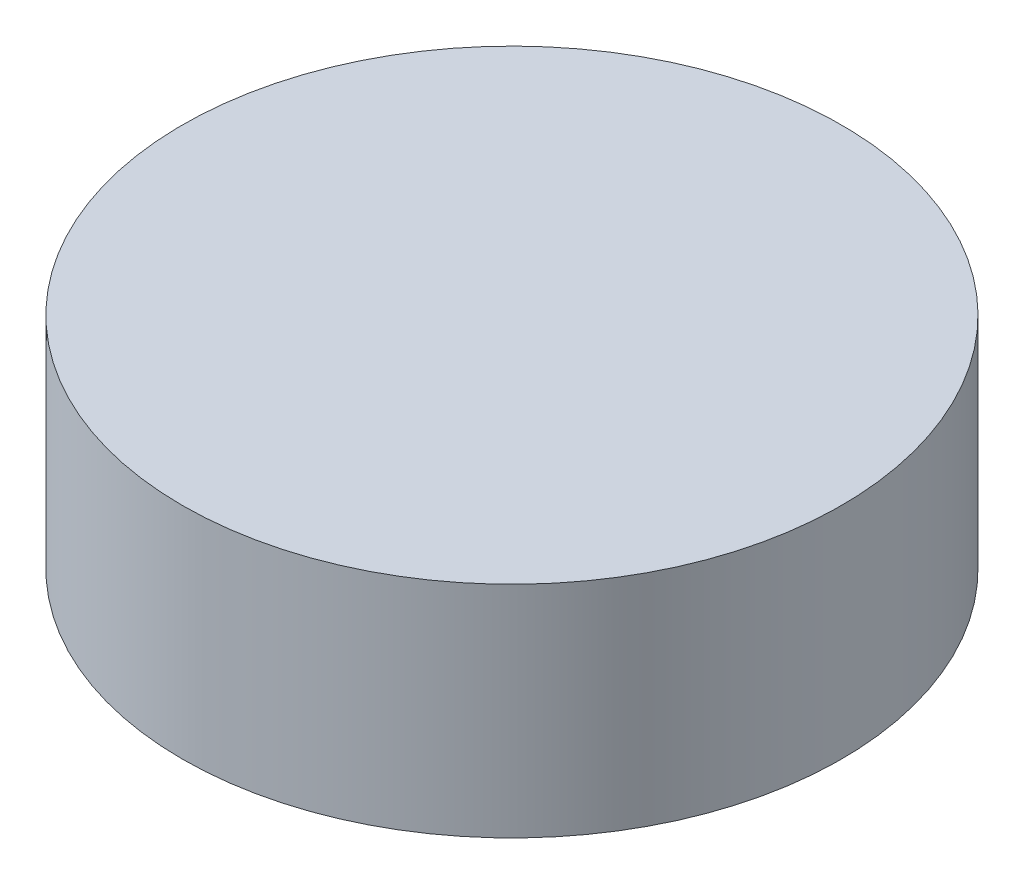
ISO-10303-21;
HEADER;
FILE_DESCRIPTION(('STEP AP214'),'2;1');
FILE_NAME('part.step','',(''),(''),'','','');
FILE_SCHEMA(('AUTOMOTIVE_DESIGN { 1 0 10303 214 1 1 1 1 }'));
ENDSEC;
DATA;
#1=APPLICATION_CONTEXT('core data for automotive mechanical design processes');
#2=APPLICATION_PROTOCOL_DEFINITION('international standard','automotive_design',2000,#1);
#3=PRODUCT_CONTEXT('',#1,'mechanical');
#4=PRODUCT('Part','Part','',(#3));
#5=PRODUCT_RELATED_PRODUCT_CATEGORY('part','',(#4));
#6=PRODUCT_DEFINITION_FORMATION('','',#4);
#7=PRODUCT_DEFINITION_CONTEXT('part definition',#1,'design');
#8=PRODUCT_DEFINITION('design','',#6,#7);
#9=PRODUCT_DEFINITION_SHAPE('','',#8);
#10=(LENGTH_UNIT() NAMED_UNIT(*) SI_UNIT(.MILLI.,.METRE.));
#11=(NAMED_UNIT(*) PLANE_ANGLE_UNIT() SI_UNIT($,.RADIAN.));
#12=(NAMED_UNIT(*) SI_UNIT($,.STERADIAN.) SOLID_ANGLE_UNIT());
#13=UNCERTAINTY_MEASURE_WITH_UNIT(LENGTH_MEASURE(1.E-05),#10,'distance_accuracy_value','');
#14=(GEOMETRIC_REPRESENTATION_CONTEXT(3) GLOBAL_UNCERTAINTY_ASSIGNED_CONTEXT((#13)) GLOBAL_UNIT_ASSIGNED_CONTEXT((#10,
#11,#12)) REPRESENTATION_CONTEXT('',''));
#15=CARTESIAN_POINT('',(0.,0.,0.));
#16=DIRECTION('',(0.,0.,1.));
#17=DIRECTION('',(1.,0.,0.));
#18=AXIS2_PLACEMENT_3D('',#15,#16,#17);
#19=CARTESIAN_POINT('',(0.,10.,0.));
#20=DIRECTION('',(0.,-1.,0.));
#21=DIRECTION('',(0.,0.,-1.));
#22=AXIS2_PLACEMENT_3D('',#19,#20,#21);
#23=CYLINDRICAL_SURFACE('',#22,30.);
#24=CARTESIAN_POINT('',(0.,10.,0.));
#25=DIRECTION('',(0.,1.,0.));
#26=DIRECTION('',(0.,0.,1.));
#27=AXIS2_PLACEMENT_3D('',#24,#25,#26);
#28=CIRCLE('',#27,30.);
#29=CARTESIAN_POINT('',(0.,10.,30.));
#30=VERTEX_POINT('',#29);
#31=EDGE_CURVE('E10',#30,#30,#28,.T.);
#32=ORIENTED_EDGE('',*,*,#31,.F.);
#33=EDGE_LOOP('',(#32));
#34=FACE_BOUND('',#33,.T.);
#35=CARTESIAN_POINT('',(0.,-10.,0.));
#36=DIRECTION('',(0.,1.,0.));
#37=DIRECTION('',(0.,0.,1.));
#38=AXIS2_PLACEMENT_3D('',#35,#36,#37);
#39=CIRCLE('',#38,30.);
#40=CARTESIAN_POINT('',(0.,-10.,30.));
#41=VERTEX_POINT('',#40);
#42=EDGE_CURVE('E34',#41,#41,#39,.T.);
#43=ORIENTED_EDGE('',*,*,#42,.T.);
#44=EDGE_LOOP('',(#43));
#45=FACE_BOUND('',#44,.T.);
#46=ADVANCED_FACE('F31',(#34,#45),#23,.T.);
#47=CARTESIAN_POINT('',(0.,10.,0.));
#48=DIRECTION('',(0.,1.,0.));
#49=DIRECTION('',(0.,0.,1.));
#50=AXIS2_PLACEMENT_3D('',#47,#48,#49);
#51=PLANE('',#50);
#52=ORIENTED_EDGE('',*,*,#31,.T.);
#53=EDGE_LOOP('',(#52));
#54=FACE_BOUND('',#53,.T.);
#55=ADVANCED_FACE('F60',(#54),#51,.T.);
#56=CARTESIAN_POINT('',(0.,-10.,0.));
#57=DIRECTION('',(0.,1.,0.));
#58=DIRECTION('',(0.,0.,1.));
#59=AXIS2_PLACEMENT_3D('',#56,#57,#58);
#60=PLANE('',#59);
#61=CARTESIAN_POINT('',(0.,-10.,0.));
#62=DIRECTION('',(0.,-1.,0.));
#63=DIRECTION('',(0.,0.,-1.));
#64=AXIS2_PLACEMENT_3D('',#61,#62,#63);
#65=CIRCLE('',#64,23.);
#66=CARTESIAN_POINT('',(0.,-10.,-23.));
#67=VERTEX_POINT('',#66);
#68=EDGE_CURVE('E43',#67,#67,#65,.T.);
#69=ORIENTED_EDGE('',*,*,#68,.F.);
#70=EDGE_LOOP('',(#69));
#71=FACE_BOUND('',#70,.T.);
#72=ORIENTED_EDGE('',*,*,#42,.F.);
#73=EDGE_LOOP('',(#72));
#74=FACE_BOUND('',#73,.T.);
#75=ADVANCED_FACE('F54',(#71,#74),#60,.F.);
#76=CARTESIAN_POINT('',(0.,5.,0.));
#77=DIRECTION('',(0.,-1.,0.));
#78=DIRECTION('',(0.,0.,-1.));
#79=AXIS2_PLACEMENT_3D('',#76,#77,#78);
#80=CYLINDRICAL_SURFACE('',#79,23.);
#81=CARTESIAN_POINT('',(0.,5.,0.));
#82=DIRECTION('',(0.,-1.,0.));
#83=DIRECTION('',(0.,0.,-1.));
#84=AXIS2_PLACEMENT_3D('',#81,#82,#83);
#85=CIRCLE('',#84,23.);
#86=CARTESIAN_POINT('',(0.,5.,-23.));
#87=VERTEX_POINT('',#86);
#88=EDGE_CURVE('E41',#87,#87,#85,.T.);
#89=ORIENTED_EDGE('',*,*,#88,.F.);
#90=EDGE_LOOP('',(#89));
#91=FACE_BOUND('',#90,.T.);
#92=ORIENTED_EDGE('',*,*,#68,.T.);
#93=EDGE_LOOP('',(#92));
#94=FACE_BOUND('',#93,.T.);
#95=ADVANCED_FACE('F51',(#91,#94),#80,.F.);
#96=CARTESIAN_POINT('',(0.,5.,0.));
#97=DIRECTION('',(0.,-1.,0.));
#98=DIRECTION('',(0.,0.,-1.));
#99=AXIS2_PLACEMENT_3D('',#96,#97,#98);
#100=PLANE('',#99);
#101=ORIENTED_EDGE('',*,*,#88,.T.);
#102=EDGE_LOOP('',(#101));
#103=FACE_BOUND('',#102,.T.);
#104=ADVANCED_FACE('F49',(#103),#100,.T.);
#105=CLOSED_SHELL('',(#46,#55,#75,#95,#104));
#106=MANIFOLD_SOLID_BREP('B2',#105);
#107=ADVANCED_BREP_SHAPE_REPRESENTATION('',(#18,#106),#14);
#108=SHAPE_DEFINITION_REPRESENTATION(#9,#107);
ENDSEC;
END-ISO-10303-21;
